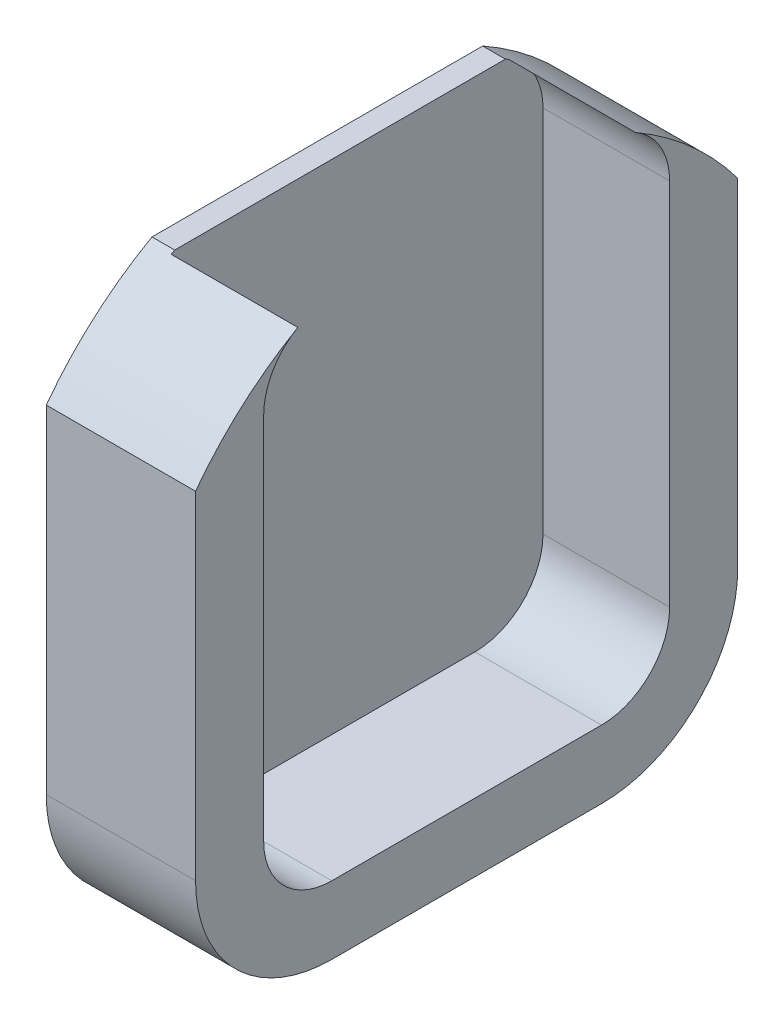
ISO-10303-21;
HEADER;
FILE_DESCRIPTION(('STEP AP214'),'2;1');
FILE_NAME('part.step','',(''),(''),'','','');
FILE_SCHEMA(('AUTOMOTIVE_DESIGN { 1 0 10303 214 1 1 1 1 }'));
ENDSEC;
DATA;
#1=APPLICATION_CONTEXT('core data for automotive mechanical design processes');
#2=APPLICATION_PROTOCOL_DEFINITION('international standard','automotive_design',2000,#1);
#3=PRODUCT_CONTEXT('',#1,'mechanical');
#4=PRODUCT('Part','Part','',(#3));
#5=PRODUCT_RELATED_PRODUCT_CATEGORY('part','',(#4));
#6=PRODUCT_DEFINITION_FORMATION('','',#4);
#7=PRODUCT_DEFINITION_CONTEXT('part definition',#1,'design');
#8=PRODUCT_DEFINITION('design','',#6,#7);
#9=PRODUCT_DEFINITION_SHAPE('','',#8);
#10=(LENGTH_UNIT() NAMED_UNIT(*) SI_UNIT(.MILLI.,.METRE.));
#11=(NAMED_UNIT(*) PLANE_ANGLE_UNIT() SI_UNIT($,.RADIAN.));
#12=(NAMED_UNIT(*) SI_UNIT($,.STERADIAN.) SOLID_ANGLE_UNIT());
#13=UNCERTAINTY_MEASURE_WITH_UNIT(LENGTH_MEASURE(1.E-05),#10,'distance_accuracy_value','');
#14=(GEOMETRIC_REPRESENTATION_CONTEXT(3) GLOBAL_UNCERTAINTY_ASSIGNED_CONTEXT((#13)) GLOBAL_UNIT_ASSIGNED_CONTEXT((#10,
#11,#12)) REPRESENTATION_CONTEXT('',''));
#15=CARTESIAN_POINT('',(0.,0.,0.));
#16=DIRECTION('',(0.,0.,1.));
#17=DIRECTION('',(1.,0.,0.));
#18=AXIS2_PLACEMENT_3D('',#15,#16,#17);
#19=CARTESIAN_POINT('',(-11.15,0.,0.));
#20=DIRECTION('',(1.,0.,0.));
#21=DIRECTION('',(0.,0.,-1.));
#22=AXIS2_PLACEMENT_3D('',#19,#20,#21);
#23=PLANE('',#22);
#24=CARTESIAN_POINT('',(-11.15,-20.0000000000001,0.));
#25=DIRECTION('',(1.,0.,0.));
#26=DIRECTION('',(0.,0.,-1.));
#27=AXIS2_PLACEMENT_3D('',#24,#25,#26);
#28=CIRCLE('',#27,29.8);
#29=CARTESIAN_POINT('',(-11.15,5.99999999999995,14.561593319414));
#30=VERTEX_POINT('',#29);
#31=CARTESIAN_POINT('',(-11.15,5.82560425775606,14.8686974789916));
#32=VERTEX_POINT('',#31);
#33=EDGE_CURVE('E107',#30,#32,#28,.T.);
#34=ORIENTED_EDGE('',*,*,#33,.T.);
#35=CARTESIAN_POINT('',(-11.15,0.62581816559041,11.875));
#36=DIRECTION('',(1.,0.,0.));
#37=DIRECTION('',(0.,0.,-1.));
#38=AXIS2_PLACEMENT_3D('',#35,#36,#37);
#39=CIRCLE('',#38,5.99999999999999);
#40=CARTESIAN_POINT('',(-11.15,0.62581816559041,17.875));
#41=VERTEX_POINT('',#40);
#42=EDGE_CURVE('E221',#32,#41,#39,.T.);
#43=ORIENTED_EDGE('',*,*,#42,.T.);
#44=DIRECTION('',(0.,1.,0.));
#45=VECTOR('',#44,1.);
#46=CARTESIAN_POINT('',(-11.15,0.,17.875));
#47=LINE('',#46,#45);
#48=CARTESIAN_POINT('',(-11.15,-31.875,17.875));
#49=VERTEX_POINT('',#48);
#50=EDGE_CURVE('E274',#49,#41,#47,.T.);
#51=ORIENTED_EDGE('',*,*,#50,.F.);
#52=CARTESIAN_POINT('',(-11.15,-31.875,11.875));
#53=DIRECTION('',(1.,0.,0.));
#54=DIRECTION('',(0.,0.,-1.));
#55=AXIS2_PLACEMENT_3D('',#52,#53,#54);
#56=CIRCLE('',#55,6.);
#57=CARTESIAN_POINT('',(-11.15,-37.875,11.875));
#58=VERTEX_POINT('',#57);
#59=EDGE_CURVE('E281',#49,#58,#56,.T.);
#60=ORIENTED_EDGE('',*,*,#59,.T.);
#61=DIRECTION('',(0.,0.,1.));
#62=VECTOR('',#61,1.);
#63=CARTESIAN_POINT('',(-11.15,-37.875,0.));
#64=LINE('',#63,#62);
#65=CARTESIAN_POINT('',(-11.15,-37.875,-11.875));
#66=VERTEX_POINT('',#65);
#67=EDGE_CURVE('E285',#66,#58,#64,.T.);
#68=ORIENTED_EDGE('',*,*,#67,.F.);
#69=CARTESIAN_POINT('',(-11.15,-31.875,-11.875));
#70=DIRECTION('',(1.,0.,0.));
#71=DIRECTION('',(0.,0.,-1.));
#72=AXIS2_PLACEMENT_3D('',#69,#70,#71);
#73=CIRCLE('',#72,6.);
#74=CARTESIAN_POINT('',(-11.15,-31.875,-17.875));
#75=VERTEX_POINT('',#74);
#76=EDGE_CURVE('E538',#66,#75,#73,.T.);
#77=ORIENTED_EDGE('',*,*,#76,.T.);
#78=DIRECTION('',(0.,-1.,0.));
#79=VECTOR('',#78,1.);
#80=CARTESIAN_POINT('',(-11.15,0.,-17.875));
#81=LINE('',#80,#79);
#82=CARTESIAN_POINT('',(-11.15,0.625818165590417,-17.875));
#83=VERTEX_POINT('',#82);
#84=EDGE_CURVE('E534',#83,#75,#81,.T.);
#85=ORIENTED_EDGE('',*,*,#84,.F.);
#86=CARTESIAN_POINT('',(-11.15,0.625818165590417,-11.875));
#87=DIRECTION('',(1.,0.,0.));
#88=DIRECTION('',(0.,0.,-1.));
#89=AXIS2_PLACEMENT_3D('',#86,#87,#88);
#90=CIRCLE('',#89,6.);
#91=CARTESIAN_POINT('',(-11.15,5.82560425775607,-14.8686974789916));
#92=VERTEX_POINT('',#91);
#93=EDGE_CURVE('E200',#83,#92,#90,.T.);
#94=ORIENTED_EDGE('',*,*,#93,.T.);
#95=CARTESIAN_POINT('',(-11.15,5.99999999999995,-14.561593319414));
#96=VERTEX_POINT('',#95);
#97=EDGE_CURVE('E122',#92,#96,#28,.T.);
#98=ORIENTED_EDGE('',*,*,#97,.T.);
#99=DIRECTION('',(0.,0.,-1.));
#100=VECTOR('',#99,1.);
#101=CARTESIAN_POINT('',(-11.15,5.99999999999995,0.));
#102=LINE('',#101,#100);
#103=EDGE_CURVE('E125',#30,#96,#102,.T.);
#104=ORIENTED_EDGE('',*,*,#103,.F.);
#105=EDGE_LOOP('',(#34,#43,#51,#60,#68,#77,#85,#94,#98,#104));
#106=FACE_BOUND('',#105,.T.);
#107=ADVANCED_FACE('F39',(#106),#23,.T.);
#108=CARTESIAN_POINT('',(-11.15,-20.0000000000001,0.));
#109=DIRECTION('',(-1.,0.,0.));
#110=DIRECTION('',(0.,0.,1.));
#111=AXIS2_PLACEMENT_3D('',#108,#109,#110);
#112=CYLINDRICAL_SURFACE('',#111,29.8);
#113=CARTESIAN_POINT('',(-13.15,-20.0000000000001,0.));
#114=DIRECTION('',(1.,0.,0.));
#115=DIRECTION('',(0.,0.,-1.));
#116=AXIS2_PLACEMENT_3D('',#113,#114,#115);
#117=CIRCLE('',#116,29.8);
#118=CARTESIAN_POINT('',(-13.15,-2.16676207190629,-23.875));
#119=VERTEX_POINT('',#118);
#120=CARTESIAN_POINT('',(-13.15,5.99999999999995,-14.561593319414));
#121=VERTEX_POINT('',#120);
#122=EDGE_CURVE('E97',#119,#121,#117,.T.);
#123=ORIENTED_EDGE('',*,*,#122,.T.);
#124=DIRECTION('',(-1.,0.,0.));
#125=VECTOR('',#124,1.);
#126=CARTESIAN_POINT('',(-11.15,5.99999999999995,-14.561593319414));
#127=LINE('',#126,#125);
#128=EDGE_CURVE('E11',#96,#121,#127,.T.);
#129=ORIENTED_EDGE('',*,*,#128,.F.);
#130=ORIENTED_EDGE('',*,*,#97,.F.);
#131=DIRECTION('',(1.,0.,0.));
#132=VECTOR('',#131,1.);
#133=CARTESIAN_POINT('',(-11.15,5.82560425775607,-14.8686974789916));
#134=LINE('',#133,#132);
#135=CARTESIAN_POINT('',(0.,5.82560425775607,-14.8686974789916));
#136=VERTEX_POINT('',#135);
#137=EDGE_CURVE('E54',#92,#136,#134,.T.);
#138=ORIENTED_EDGE('',*,*,#137,.T.);
#139=CARTESIAN_POINT('',(0.,-20.0000000000001,0.));
#140=DIRECTION('',(1.,0.,0.));
#141=DIRECTION('',(0.,0.,-1.));
#142=AXIS2_PLACEMENT_3D('',#139,#140,#141);
#143=CIRCLE('',#142,29.8);
#144=CARTESIAN_POINT('',(0.,-2.16676207190629,-23.875));
#145=VERTEX_POINT('',#144);
#146=EDGE_CURVE('E101',#145,#136,#143,.T.);
#147=ORIENTED_EDGE('',*,*,#146,.F.);
#148=DIRECTION('',(-1.,0.,0.));
#149=VECTOR('',#148,1.);
#150=CARTESIAN_POINT('',(-11.15,-2.16676207190629,-23.875));
#151=LINE('',#150,#149);
#152=EDGE_CURVE('E93',#145,#119,#151,.T.);
#153=ORIENTED_EDGE('',*,*,#152,.T.);
#154=EDGE_LOOP('',(#123,#129,#130,#138,#147,#153));
#155=FACE_BOUND('',#154,.T.);
#156=ADVANCED_FACE('F95',(#155),#112,.T.);
#157=CARTESIAN_POINT('',(-11.15,5.99999999999995,0.));
#158=DIRECTION('',(0.,1.,0.));
#159=DIRECTION('',(0.,0.,1.));
#160=AXIS2_PLACEMENT_3D('',#157,#158,#159);
#161=PLANE('',#160);
#162=DIRECTION('',(0.,0.,-1.));
#163=VECTOR('',#162,1.);
#164=CARTESIAN_POINT('',(-13.15,5.99999999999995,0.));
#165=LINE('',#164,#163);
#166=CARTESIAN_POINT('',(-13.15,5.99999999999995,14.561593319414));
#167=VERTEX_POINT('',#166);
#168=EDGE_CURVE('E115',#167,#121,#165,.T.);
#169=ORIENTED_EDGE('',*,*,#168,.F.);
#170=DIRECTION('',(-1.,0.,0.));
#171=VECTOR('',#170,1.);
#172=CARTESIAN_POINT('',(-11.15,5.99999999999995,14.561593319414));
#173=LINE('',#172,#171);
#174=EDGE_CURVE('E47',#30,#167,#173,.T.);
#175=ORIENTED_EDGE('',*,*,#174,.F.);
#176=ORIENTED_EDGE('',*,*,#103,.T.);
#177=ORIENTED_EDGE('',*,*,#128,.T.);
#178=EDGE_LOOP('',(#169,#175,#176,#177));
#179=FACE_BOUND('',#178,.T.);
#180=ADVANCED_FACE('F41',(#179),#161,.T.);
#181=CARTESIAN_POINT('',(-13.15,-2.1667620719063,23.875));
#182=VERTEX_POINT('',#181);
#183=EDGE_CURVE('E118',#167,#182,#117,.T.);
#184=ORIENTED_EDGE('',*,*,#183,.T.);
#185=DIRECTION('',(-1.,0.,0.));
#186=VECTOR('',#185,1.);
#187=CARTESIAN_POINT('',(-11.15,-2.1667620719063,23.875));
#188=LINE('',#187,#186);
#189=CARTESIAN_POINT('',(0.,-2.1667620719063,23.875));
#190=VERTEX_POINT('',#189);
#191=EDGE_CURVE('E138',#190,#182,#188,.T.);
#192=ORIENTED_EDGE('',*,*,#191,.F.);
#193=CARTESIAN_POINT('',(0.,5.82560425775606,14.8686974789916));
#194=VERTEX_POINT('',#193);
#195=EDGE_CURVE('E186',#194,#190,#143,.T.);
#196=ORIENTED_EDGE('',*,*,#195,.F.);
#197=DIRECTION('',(1.,0.,0.));
#198=VECTOR('',#197,1.);
#199=CARTESIAN_POINT('',(-11.15,5.82560425775606,14.8686974789916));
#200=LINE('',#199,#198);
#201=EDGE_CURVE('E116',#32,#194,#200,.T.);
#202=ORIENTED_EDGE('',*,*,#201,.F.);
#203=ORIENTED_EDGE('',*,*,#33,.F.);
#204=ORIENTED_EDGE('',*,*,#174,.T.);
#205=EDGE_LOOP('',(#184,#192,#196,#202,#203,#204));
#206=FACE_BOUND('',#205,.T.);
#207=ADVANCED_FACE('F141',(#206),#112,.T.);
#208=CARTESIAN_POINT('',(-11.15,0.,23.875));
#209=DIRECTION('',(0.,0.,1.));
#210=DIRECTION('',(1.,0.,0.));
#211=AXIS2_PLACEMENT_3D('',#208,#209,#210);
#212=PLANE('',#211);
#213=DIRECTION('',(0.,1.,0.));
#214=VECTOR('',#213,1.);
#215=CARTESIAN_POINT('',(-13.15,0.,23.875));
#216=LINE('',#215,#214);
#217=CARTESIAN_POINT('',(-13.15,-31.875,23.875));
#218=VERTEX_POINT('',#217);
#219=EDGE_CURVE('E149',#218,#182,#216,.T.);
#220=ORIENTED_EDGE('',*,*,#219,.F.);
#221=DIRECTION('',(-1.,0.,0.));
#222=VECTOR('',#221,1.);
#223=CARTESIAN_POINT('',(-11.15,-31.875,23.875));
#224=LINE('',#223,#222);
#225=CARTESIAN_POINT('',(0.,-31.875,23.875));
#226=VERTEX_POINT('',#225);
#227=EDGE_CURVE('E136',#226,#218,#224,.T.);
#228=ORIENTED_EDGE('',*,*,#227,.F.);
#229=DIRECTION('',(0.,1.,0.));
#230=VECTOR('',#229,1.);
#231=CARTESIAN_POINT('',(0.,0.,23.875));
#232=LINE('',#231,#230);
#233=EDGE_CURVE('E179',#226,#190,#232,.T.);
#234=ORIENTED_EDGE('',*,*,#233,.T.);
#235=ORIENTED_EDGE('',*,*,#191,.T.);
#236=EDGE_LOOP('',(#220,#228,#234,#235));
#237=FACE_BOUND('',#236,.T.);
#238=ADVANCED_FACE('F177',(#237),#212,.T.);
#239=CARTESIAN_POINT('',(-11.15,-31.875,11.875));
#240=DIRECTION('',(-1.,0.,0.));
#241=DIRECTION('',(0.,0.,1.));
#242=AXIS2_PLACEMENT_3D('',#239,#240,#241);
#243=CYLINDRICAL_SURFACE('',#242,12.);
#244=CARTESIAN_POINT('',(-13.15,-31.875,11.875));
#245=DIRECTION('',(1.,0.,0.));
#246=DIRECTION('',(0.,0.,-1.));
#247=AXIS2_PLACEMENT_3D('',#244,#245,#246);
#248=CIRCLE('',#247,12.);
#249=CARTESIAN_POINT('',(-13.15,-43.875,11.875));
#250=VERTEX_POINT('',#249);
#251=EDGE_CURVE('E154',#218,#250,#248,.T.);
#252=ORIENTED_EDGE('',*,*,#251,.T.);
#253=DIRECTION('',(-1.,0.,0.));
#254=VECTOR('',#253,1.);
#255=CARTESIAN_POINT('',(-11.15,-43.875,11.875));
#256=LINE('',#255,#254);
#257=CARTESIAN_POINT('',(0.,-43.875,11.875));
#258=VERTEX_POINT('',#257);
#259=EDGE_CURVE('E134',#258,#250,#256,.T.);
#260=ORIENTED_EDGE('',*,*,#259,.F.);
#261=CARTESIAN_POINT('',(0.,-31.875,11.875));
#262=DIRECTION('',(1.,0.,0.));
#263=DIRECTION('',(0.,0.,-1.));
#264=AXIS2_PLACEMENT_3D('',#261,#262,#263);
#265=CIRCLE('',#264,12.);
#266=EDGE_CURVE('E173',#226,#258,#265,.T.);
#267=ORIENTED_EDGE('',*,*,#266,.F.);
#268=ORIENTED_EDGE('',*,*,#227,.T.);
#269=EDGE_LOOP('',(#252,#260,#267,#268));
#270=FACE_BOUND('',#269,.T.);
#271=ADVANCED_FACE('F170',(#270),#243,.T.);
#272=CARTESIAN_POINT('',(-11.15,-43.875,0.));
#273=DIRECTION('',(0.,-1.,0.));
#274=DIRECTION('',(0.,0.,-1.));
#275=AXIS2_PLACEMENT_3D('',#272,#273,#274);
#276=PLANE('',#275);
#277=DIRECTION('',(0.,0.,1.));
#278=VECTOR('',#277,1.);
#279=CARTESIAN_POINT('',(-13.15,-43.875,0.));
#280=LINE('',#279,#278);
#281=CARTESIAN_POINT('',(-13.15,-43.875,-11.875));
#282=VERTEX_POINT('',#281);
#283=EDGE_CURVE('E127',#282,#250,#280,.T.);
#284=ORIENTED_EDGE('',*,*,#283,.F.);
#285=DIRECTION('',(-1.,0.,0.));
#286=VECTOR('',#285,1.);
#287=CARTESIAN_POINT('',(-11.15,-43.875,-11.875));
#288=LINE('',#287,#286);
#289=CARTESIAN_POINT('',(0.,-43.875,-11.875));
#290=VERTEX_POINT('',#289);
#291=EDGE_CURVE('E132',#290,#282,#288,.T.);
#292=ORIENTED_EDGE('',*,*,#291,.F.);
#293=DIRECTION('',(0.,0.,1.));
#294=VECTOR('',#293,1.);
#295=CARTESIAN_POINT('',(0.,-43.875,0.));
#296=LINE('',#295,#294);
#297=EDGE_CURVE('E166',#290,#258,#296,.T.);
#298=ORIENTED_EDGE('',*,*,#297,.T.);
#299=ORIENTED_EDGE('',*,*,#259,.T.);
#300=EDGE_LOOP('',(#284,#292,#298,#299));
#301=FACE_BOUND('',#300,.T.);
#302=ADVANCED_FACE('F160',(#301),#276,.T.);
#303=CARTESIAN_POINT('',(-11.15,-31.875,-11.875));
#304=DIRECTION('',(-1.,0.,0.));
#305=DIRECTION('',(0.,0.,1.));
#306=AXIS2_PLACEMENT_3D('',#303,#304,#305);
#307=CYLINDRICAL_SURFACE('',#306,12.);
#308=CARTESIAN_POINT('',(-13.15,-31.875,-11.875));
#309=DIRECTION('',(1.,0.,0.));
#310=DIRECTION('',(0.,0.,-1.));
#311=AXIS2_PLACEMENT_3D('',#308,#309,#310);
#312=CIRCLE('',#311,12.);
#313=CARTESIAN_POINT('',(-13.15,-31.875,-23.875));
#314=VERTEX_POINT('',#313);
#315=EDGE_CURVE('E123',#282,#314,#312,.T.);
#316=ORIENTED_EDGE('',*,*,#315,.T.);
#317=DIRECTION('',(-1.,0.,0.));
#318=VECTOR('',#317,1.);
#319=CARTESIAN_POINT('',(-11.15,-31.875,-23.875));
#320=LINE('',#319,#318);
#321=CARTESIAN_POINT('',(0.,-31.875,-23.875));
#322=VERTEX_POINT('',#321);
#323=EDGE_CURVE('E106',#322,#314,#320,.T.);
#324=ORIENTED_EDGE('',*,*,#323,.F.);
#325=CARTESIAN_POINT('',(0.,-31.875,-11.875));
#326=DIRECTION('',(1.,0.,0.));
#327=DIRECTION('',(0.,0.,-1.));
#328=AXIS2_PLACEMENT_3D('',#325,#326,#327);
#329=CIRCLE('',#328,12.);
#330=EDGE_CURVE('E195',#290,#322,#329,.T.);
#331=ORIENTED_EDGE('',*,*,#330,.F.);
#332=ORIENTED_EDGE('',*,*,#291,.T.);
#333=EDGE_LOOP('',(#316,#324,#331,#332));
#334=FACE_BOUND('',#333,.T.);
#335=ADVANCED_FACE('F326',(#334),#307,.T.);
#336=CARTESIAN_POINT('',(-11.15,0.,-23.875));
#337=DIRECTION('',(0.,0.,-1.));
#338=DIRECTION('',(0.,1.,0.));
#339=AXIS2_PLACEMENT_3D('',#336,#337,#338);
#340=PLANE('',#339);
#341=DIRECTION('',(0.,-1.,0.));
#342=VECTOR('',#341,1.);
#343=CARTESIAN_POINT('',(-13.15,0.,-23.875));
#344=LINE('',#343,#342);
#345=EDGE_CURVE('E113',#119,#314,#344,.T.);
#346=ORIENTED_EDGE('',*,*,#345,.F.);
#347=ORIENTED_EDGE('',*,*,#152,.F.);
#348=DIRECTION('',(0.,-1.,0.));
#349=VECTOR('',#348,1.);
#350=CARTESIAN_POINT('',(0.,0.,-23.875));
#351=LINE('',#350,#349);
#352=EDGE_CURVE('E198',#145,#322,#351,.T.);
#353=ORIENTED_EDGE('',*,*,#352,.T.);
#354=ORIENTED_EDGE('',*,*,#323,.T.);
#355=EDGE_LOOP('',(#346,#347,#353,#354));
#356=FACE_BOUND('',#355,.T.);
#357=ADVANCED_FACE('F119',(#356),#340,.T.);
#358=CARTESIAN_POINT('',(-13.15,0.,0.));
#359=DIRECTION('',(1.,0.,0.));
#360=DIRECTION('',(0.,0.,-1.));
#361=AXIS2_PLACEMENT_3D('',#358,#359,#360);
#362=PLANE('',#361);
#363=ORIENTED_EDGE('',*,*,#122,.F.);
#364=ORIENTED_EDGE('',*,*,#345,.T.);
#365=ORIENTED_EDGE('',*,*,#315,.F.);
#366=ORIENTED_EDGE('',*,*,#283,.T.);
#367=ORIENTED_EDGE('',*,*,#251,.F.);
#368=ORIENTED_EDGE('',*,*,#219,.T.);
#369=ORIENTED_EDGE('',*,*,#183,.F.);
#370=ORIENTED_EDGE('',*,*,#168,.T.);
#371=EDGE_LOOP('',(#363,#364,#365,#366,#367,#368,#369,#370));
#372=FACE_BOUND('',#371,.T.);
#373=ADVANCED_FACE('F111',(#372),#362,.F.);
#374=CARTESIAN_POINT('',(-11.15,0.62581816559041,11.875));
#375=DIRECTION('',(1.,0.,0.));
#376=DIRECTION('',(0.,0.,-1.));
#377=AXIS2_PLACEMENT_3D('',#374,#375,#376);
#378=CYLINDRICAL_SURFACE('',#377,5.99999999999999);
#379=CARTESIAN_POINT('',(0.,0.62581816559041,11.875));
#380=DIRECTION('',(1.,0.,0.));
#381=DIRECTION('',(0.,0.,-1.));
#382=AXIS2_PLACEMENT_3D('',#379,#380,#381);
#383=CIRCLE('',#382,5.99999999999999);
#384=CARTESIAN_POINT('',(0.,0.62581816559041,17.875));
#385=VERTEX_POINT('',#384);
#386=EDGE_CURVE('E189',#194,#385,#383,.T.);
#387=ORIENTED_EDGE('',*,*,#386,.T.);
#388=DIRECTION('',(1.,0.,0.));
#389=VECTOR('',#388,1.);
#390=CARTESIAN_POINT('',(-11.15,0.62581816559041,17.875));
#391=LINE('',#390,#389);
#392=EDGE_CURVE('E203',#41,#385,#391,.T.);
#393=ORIENTED_EDGE('',*,*,#392,.F.);
#394=ORIENTED_EDGE('',*,*,#42,.F.);
#395=ORIENTED_EDGE('',*,*,#201,.T.);
#396=EDGE_LOOP('',(#387,#393,#394,#395));
#397=FACE_BOUND('',#396,.T.);
#398=ADVANCED_FACE('F305',(#397),#378,.F.);
#399=CARTESIAN_POINT('',(-11.15,0.,17.875));
#400=DIRECTION('',(0.,0.,-1.));
#401=DIRECTION('',(0.,1.,0.));
#402=AXIS2_PLACEMENT_3D('',#399,#400,#401);
#403=PLANE('',#402);
#404=DIRECTION('',(0.,1.,0.));
#405=VECTOR('',#404,1.);
#406=CARTESIAN_POINT('',(0.,0.,17.875));
#407=LINE('',#406,#405);
#408=CARTESIAN_POINT('',(0.,-31.875,17.875));
#409=VERTEX_POINT('',#408);
#410=EDGE_CURVE('E276',#409,#385,#407,.T.);
#411=ORIENTED_EDGE('',*,*,#410,.F.);
#412=DIRECTION('',(1.,0.,0.));
#413=VECTOR('',#412,1.);
#414=CARTESIAN_POINT('',(-11.15,-31.875,17.875));
#415=LINE('',#414,#413);
#416=EDGE_CURVE('E206',#49,#409,#415,.T.);
#417=ORIENTED_EDGE('',*,*,#416,.F.);
#418=ORIENTED_EDGE('',*,*,#50,.T.);
#419=ORIENTED_EDGE('',*,*,#392,.T.);
#420=EDGE_LOOP('',(#411,#417,#418,#419));
#421=FACE_BOUND('',#420,.T.);
#422=ADVANCED_FACE('F273',(#421),#403,.T.);
#423=CARTESIAN_POINT('',(-11.15,-31.875,11.875));
#424=DIRECTION('',(1.,0.,0.));
#425=DIRECTION('',(0.,0.,-1.));
#426=AXIS2_PLACEMENT_3D('',#423,#424,#425);
#427=CYLINDRICAL_SURFACE('',#426,6.);
#428=CARTESIAN_POINT('',(0.,-31.875,11.875));
#429=DIRECTION('',(1.,0.,0.));
#430=DIRECTION('',(0.,0.,-1.));
#431=AXIS2_PLACEMENT_3D('',#428,#429,#430);
#432=CIRCLE('',#431,6.);
#433=CARTESIAN_POINT('',(0.,-37.875,11.875));
#434=VERTEX_POINT('',#433);
#435=EDGE_CURVE('E302',#409,#434,#432,.T.);
#436=ORIENTED_EDGE('',*,*,#435,.T.);
#437=DIRECTION('',(1.,0.,0.));
#438=VECTOR('',#437,1.);
#439=CARTESIAN_POINT('',(-11.15,-37.875,11.875));
#440=LINE('',#439,#438);
#441=EDGE_CURVE('E209',#58,#434,#440,.T.);
#442=ORIENTED_EDGE('',*,*,#441,.F.);
#443=ORIENTED_EDGE('',*,*,#59,.F.);
#444=ORIENTED_EDGE('',*,*,#416,.T.);
#445=EDGE_LOOP('',(#436,#442,#443,#444));
#446=FACE_BOUND('',#445,.T.);
#447=ADVANCED_FACE('F282',(#446),#427,.F.);
#448=CARTESIAN_POINT('',(-11.15,-37.875,0.));
#449=DIRECTION('',(0.,1.,0.));
#450=DIRECTION('',(0.,0.,1.));
#451=AXIS2_PLACEMENT_3D('',#448,#449,#450);
#452=PLANE('',#451);
#453=DIRECTION('',(0.,0.,1.));
#454=VECTOR('',#453,1.);
#455=CARTESIAN_POINT('',(0.,-37.875,0.));
#456=LINE('',#455,#454);
#457=CARTESIAN_POINT('',(0.,-37.875,-11.875));
#458=VERTEX_POINT('',#457);
#459=EDGE_CURVE('E299',#458,#434,#456,.T.);
#460=ORIENTED_EDGE('',*,*,#459,.F.);
#461=DIRECTION('',(1.,0.,0.));
#462=VECTOR('',#461,1.);
#463=CARTESIAN_POINT('',(-11.15,-37.875,-11.875));
#464=LINE('',#463,#462);
#465=EDGE_CURVE('E212',#66,#458,#464,.T.);
#466=ORIENTED_EDGE('',*,*,#465,.F.);
#467=ORIENTED_EDGE('',*,*,#67,.T.);
#468=ORIENTED_EDGE('',*,*,#441,.T.);
#469=EDGE_LOOP('',(#460,#466,#467,#468));
#470=FACE_BOUND('',#469,.T.);
#471=ADVANCED_FACE('F410',(#470),#452,.T.);
#472=CARTESIAN_POINT('',(-11.15,-31.875,-11.875));
#473=DIRECTION('',(1.,0.,0.));
#474=DIRECTION('',(0.,0.,-1.));
#475=AXIS2_PLACEMENT_3D('',#472,#473,#474);
#476=CYLINDRICAL_SURFACE('',#475,6.);
#477=CARTESIAN_POINT('',(0.,-31.875,-11.875));
#478=DIRECTION('',(1.,0.,0.));
#479=DIRECTION('',(0.,0.,-1.));
#480=AXIS2_PLACEMENT_3D('',#477,#478,#479);
#481=CIRCLE('',#480,6.);
#482=CARTESIAN_POINT('',(0.,-31.875,-17.875));
#483=VERTEX_POINT('',#482);
#484=EDGE_CURVE('E296',#458,#483,#481,.T.);
#485=ORIENTED_EDGE('',*,*,#484,.T.);
#486=DIRECTION('',(1.,0.,0.));
#487=VECTOR('',#486,1.);
#488=CARTESIAN_POINT('',(-11.15,-31.875,-17.875));
#489=LINE('',#488,#487);
#490=EDGE_CURVE('E215',#75,#483,#489,.T.);
#491=ORIENTED_EDGE('',*,*,#490,.F.);
#492=ORIENTED_EDGE('',*,*,#76,.F.);
#493=ORIENTED_EDGE('',*,*,#465,.T.);
#494=EDGE_LOOP('',(#485,#491,#492,#493));
#495=FACE_BOUND('',#494,.T.);
#496=ADVANCED_FACE('F420',(#495),#476,.F.);
#497=CARTESIAN_POINT('',(-11.15,0.,-17.875));
#498=DIRECTION('',(0.,0.,1.));
#499=DIRECTION('',(0.,-1.,0.));
#500=AXIS2_PLACEMENT_3D('',#497,#498,#499);
#501=PLANE('',#500);
#502=DIRECTION('',(0.,-1.,0.));
#503=VECTOR('',#502,1.);
#504=CARTESIAN_POINT('',(0.,0.,-17.875));
#505=LINE('',#504,#503);
#506=CARTESIAN_POINT('',(0.,0.625818165590417,-17.875));
#507=VERTEX_POINT('',#506);
#508=EDGE_CURVE('E293',#507,#483,#505,.T.);
#509=ORIENTED_EDGE('',*,*,#508,.F.);
#510=DIRECTION('',(1.,0.,0.));
#511=VECTOR('',#510,1.);
#512=CARTESIAN_POINT('',(-11.15,0.625818165590417,-17.875));
#513=LINE('',#512,#511);
#514=EDGE_CURVE('E218',#83,#507,#513,.T.);
#515=ORIENTED_EDGE('',*,*,#514,.F.);
#516=ORIENTED_EDGE('',*,*,#84,.T.);
#517=ORIENTED_EDGE('',*,*,#490,.T.);
#518=EDGE_LOOP('',(#509,#515,#516,#517));
#519=FACE_BOUND('',#518,.T.);
#520=ADVANCED_FACE('F431',(#519),#501,.T.);
#521=CARTESIAN_POINT('',(-11.15,0.625818165590417,-11.875));
#522=DIRECTION('',(1.,0.,0.));
#523=DIRECTION('',(0.,0.,-1.));
#524=AXIS2_PLACEMENT_3D('',#521,#522,#523);
#525=CYLINDRICAL_SURFACE('',#524,6.);
#526=CARTESIAN_POINT('',(0.,0.625818165590417,-11.875));
#527=DIRECTION('',(1.,0.,0.));
#528=DIRECTION('',(0.,0.,-1.));
#529=AXIS2_PLACEMENT_3D('',#526,#527,#528);
#530=CIRCLE('',#529,6.);
#531=EDGE_CURVE('E291',#507,#136,#530,.T.);
#532=ORIENTED_EDGE('',*,*,#531,.T.);
#533=ORIENTED_EDGE('',*,*,#137,.F.);
#534=ORIENTED_EDGE('',*,*,#93,.F.);
#535=ORIENTED_EDGE('',*,*,#514,.T.);
#536=EDGE_LOOP('',(#532,#533,#534,#535));
#537=FACE_BOUND('',#536,.T.);
#538=ADVANCED_FACE('F321',(#537),#525,.F.);
#539=CARTESIAN_POINT('',(0.,0.,0.));
#540=DIRECTION('',(1.,0.,0.));
#541=DIRECTION('',(0.,0.,-1.));
#542=AXIS2_PLACEMENT_3D('',#539,#540,#541);
#543=PLANE('',#542);
#544=ORIENTED_EDGE('',*,*,#146,.T.);
#545=ORIENTED_EDGE('',*,*,#531,.F.);
#546=ORIENTED_EDGE('',*,*,#508,.T.);
#547=ORIENTED_EDGE('',*,*,#484,.F.);
#548=ORIENTED_EDGE('',*,*,#459,.T.);
#549=ORIENTED_EDGE('',*,*,#435,.F.);
#550=ORIENTED_EDGE('',*,*,#410,.T.);
#551=ORIENTED_EDGE('',*,*,#386,.F.);
#552=ORIENTED_EDGE('',*,*,#195,.T.);
#553=ORIENTED_EDGE('',*,*,#233,.F.);
#554=ORIENTED_EDGE('',*,*,#266,.T.);
#555=ORIENTED_EDGE('',*,*,#297,.F.);
#556=ORIENTED_EDGE('',*,*,#330,.T.);
#557=ORIENTED_EDGE('',*,*,#352,.F.);
#558=EDGE_LOOP('',(#544,#545,#546,#547,#548,#549,#550,#551,#552,#553,#554,#555,#556,#557));
#559=FACE_BOUND('',#558,.T.);
#560=ADVANCED_FACE('F183',(#559),#543,.T.);
#561=CLOSED_SHELL('',(#107,#156,#180,#207,#238,#271,#302,#335,#357,#373,#398,#422,#447,#471,
#496,#520,#538,#560));
#562=MANIFOLD_SOLID_BREP('B2',#561);
#563=ADVANCED_BREP_SHAPE_REPRESENTATION('',(#18,#562),#14);
#564=SHAPE_DEFINITION_REPRESENTATION(#9,#563);
ENDSEC;
END-ISO-10303-21;
